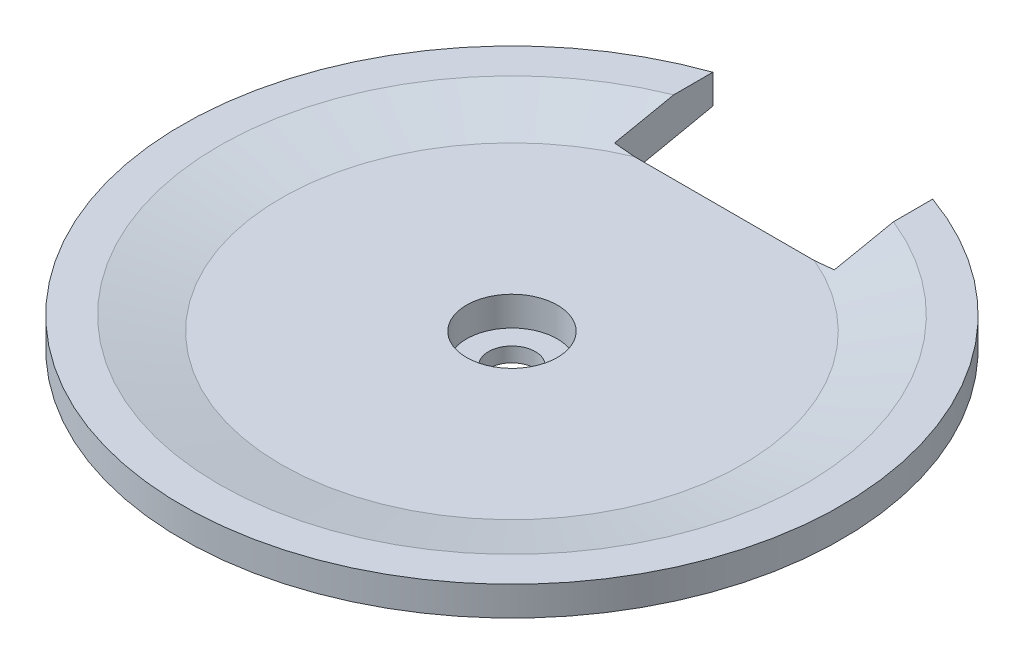
ISO-10303-21;
HEADER;
FILE_DESCRIPTION(('STEP AP214'),'2;1');
FILE_NAME('part.step','',(''),(''),'','','');
FILE_SCHEMA(('AUTOMOTIVE_DESIGN { 1 0 10303 214 1 1 1 1 }'));
ENDSEC;
DATA;
#1=APPLICATION_CONTEXT('core data for automotive mechanical design processes');
#2=APPLICATION_PROTOCOL_DEFINITION('international standard','automotive_design',2000,#1);
#3=PRODUCT_CONTEXT('',#1,'mechanical');
#4=PRODUCT('Part','Part','',(#3));
#5=PRODUCT_RELATED_PRODUCT_CATEGORY('part','',(#4));
#6=PRODUCT_DEFINITION_FORMATION('','',#4);
#7=PRODUCT_DEFINITION_CONTEXT('part definition',#1,'design');
#8=PRODUCT_DEFINITION('design','',#6,#7);
#9=PRODUCT_DEFINITION_SHAPE('','',#8);
#10=(LENGTH_UNIT() NAMED_UNIT(*) SI_UNIT(.MILLI.,.METRE.));
#11=(NAMED_UNIT(*) PLANE_ANGLE_UNIT() SI_UNIT($,.RADIAN.));
#12=(NAMED_UNIT(*) SI_UNIT($,.STERADIAN.) SOLID_ANGLE_UNIT());
#13=UNCERTAINTY_MEASURE_WITH_UNIT(LENGTH_MEASURE(1.E-05),#10,'distance_accuracy_value','');
#14=(GEOMETRIC_REPRESENTATION_CONTEXT(3) GLOBAL_UNCERTAINTY_ASSIGNED_CONTEXT((#13)) GLOBAL_UNIT_ASSIGNED_CONTEXT((#10,
#11,#12)) REPRESENTATION_CONTEXT('',''));
#15=CARTESIAN_POINT('',(0.,0.,0.));
#16=DIRECTION('',(0.,0.,1.));
#17=DIRECTION('',(1.,0.,0.));
#18=AXIS2_PLACEMENT_3D('',#15,#16,#17);
#19=CARTESIAN_POINT('',(0.,-9.52548339959391,0.));
#20=DIRECTION('',(0.,1.,0.));
#21=DIRECTION('',(0.,0.,1.));
#22=AXIS2_PLACEMENT_3D('',#19,#20,#21);
#23=CYLINDRICAL_SURFACE('',#22,1.6);
#24=CARTESIAN_POINT('',(0.,-2.,0.));
#25=DIRECTION('',(0.,1.,0.));
#26=DIRECTION('',(0.,0.,1.));
#27=AXIS2_PLACEMENT_3D('',#24,#25,#26);
#28=CIRCLE('',#27,1.6);
#29=CARTESIAN_POINT('',(0.,-2.,1.6));
#30=VERTEX_POINT('',#29);
#31=EDGE_CURVE('E198',#30,#30,#28,.T.);
#32=ORIENTED_EDGE('',*,*,#31,.T.);
#33=EDGE_LOOP('',(#32));
#34=FACE_BOUND('',#33,.T.);
#35=CARTESIAN_POINT('',(0.,-3.,0.));
#36=DIRECTION('',(0.,-1.,0.));
#37=DIRECTION('',(0.,0.,-1.));
#38=AXIS2_PLACEMENT_3D('',#35,#36,#37);
#39=CIRCLE('',#38,1.6);
#40=CARTESIAN_POINT('',(0.,-3.,-1.6));
#41=VERTEX_POINT('',#40);
#42=EDGE_CURVE('E39',#41,#41,#39,.T.);
#43=ORIENTED_EDGE('',*,*,#42,.T.);
#44=EDGE_LOOP('',(#43));
#45=FACE_BOUND('',#44,.T.);
#46=ADVANCED_FACE('F35',(#34,#45),#23,.F.);
#47=CARTESIAN_POINT('',(-11.2927829378601,-5.,0.));
#48=DIRECTION('',(0.,-1.,0.));
#49=DIRECTION('',(0.,0.,-1.));
#50=AXIS2_PLACEMENT_3D('',#47,#48,#49);
#51=PLANE('',#50);
#52=CARTESIAN_POINT('',(0.,-5.,0.));
#53=DIRECTION('',(0.,1.,0.));
#54=DIRECTION('',(0.,0.,1.));
#55=AXIS2_PLACEMENT_3D('',#52,#53,#54);
#56=CIRCLE('',#55,11.2927829378601);
#57=CARTESIAN_POINT('',(0.,-5.,11.2927829378601));
#58=VERTEX_POINT('',#57);
#59=EDGE_CURVE('E115',#58,#58,#56,.T.);
#60=ORIENTED_EDGE('',*,*,#59,.F.);
#61=EDGE_LOOP('',(#60));
#62=FACE_BOUND('',#61,.T.);
#63=CARTESIAN_POINT('',(4.26480031845422E-09,-5.,11.1141003071461));
#64=CARTESIAN_POINT('',(0.0786658461647855,-5.,11.1141032519882));
#65=CARTESIAN_POINT('',(0.157315676769288,-5.,11.1103797737511));
#66=CARTESIAN_POINT('',(0.313948501857922,-5.,11.0955995036877));
#67=CARTESIAN_POINT('',(0.391931303042091,-5.,11.0845406544976));
#68=CARTESIAN_POINT('',(0.546637267251878,-5.,11.0553740052903));
#69=CARTESIAN_POINT('',(0.623359154844762,-5.,11.0372594768458));
#70=CARTESIAN_POINT('',(0.774957227139395,-5.,10.9944470212953));
#71=CARTESIAN_POINT('',(0.849832544921893,-5.,10.9697460639653));
#72=CARTESIAN_POINT('',(1.0696353393726,-5.,10.8871082554771));
#73=CARTESIAN_POINT('',(1.21129616831553,-5.,10.8203245136018));
#74=CARTESIAN_POINT('',(1.48381466584843,-5.,10.6678218632568));
#75=CARTESIAN_POINT('',(1.61466763685802,-5.,10.58209478004));
#76=CARTESIAN_POINT('',(1.84906864373975,-5.,10.4080710006866));
#77=CARTESIAN_POINT('',(1.95395621602486,-5.,10.3215522782143));
#78=CARTESIAN_POINT('',(2.15576423909522,-5.,10.139607266595));
#79=CARTESIAN_POINT('',(2.25267919938356,-5.,10.0441749339139));
#80=CARTESIAN_POINT('',(2.43916508316452,-5.,9.84602979580943));
#81=CARTESIAN_POINT('',(2.52871902277899,-5.,9.74330111960544));
#82=CARTESIAN_POINT('',(2.70077184398592,-5.,9.53217790921119));
#83=CARTESIAN_POINT('',(2.78327230437074,-5.00000000000001,9.42378465173199));
#84=CARTESIAN_POINT('',(3.00393477304127,-5.00000000000001,9.1156415821704));
#85=CARTESIAN_POINT('',(3.13506957317215,-5.,8.91084636540875));
#86=CARTESIAN_POINT('',(3.37933619416391,-5.,8.4913474837804));
#87=CARTESIAN_POINT('',(3.49249264844667,-5.00000000000001,8.2766579057661));
#88=CARTESIAN_POINT('',(3.67669640049655,-5.00000000000001,7.89488626835507));
#89=CARTESIAN_POINT('',(3.75117006207494,-5.,7.72943773992611));
#90=CARTESIAN_POINT('',(3.89217100010204,-5.,7.39517128466577));
#91=CARTESIAN_POINT('',(3.95869721545439,-5.,7.22635291141642));
#92=CARTESIAN_POINT('',(4.08446055476594,-5.,6.88588963296016));
#93=CARTESIAN_POINT('',(4.14369217258612,-5.,6.71424270215311));
#94=CARTESIAN_POINT('',(4.25532332696383,-5.,6.36873357906713));
#95=CARTESIAN_POINT('',(4.30772206092869,-5.,6.19487112918077));
#96=CARTESIAN_POINT('',(4.45502762084513,-4.99999999999999,5.6716304240704));
#97=CARTESIAN_POINT('',(4.54042488751963,-5.,5.31954634506311));
#98=CARTESIAN_POINT('',(4.68829819875764,-5.00000000000001,4.6107761221247));
#99=CARTESIAN_POINT('',(4.7507799790915,-5.00000000000001,4.25409115297115));
#100=CARTESIAN_POINT('',(4.84145868133455,-5.00000000000001,3.62784252400032));
#101=CARTESIAN_POINT('',(4.87432654343763,-5.,3.35894232614317));
#102=CARTESIAN_POINT('',(4.92863101879915,-5.,2.81996610245077));
#103=CARTESIAN_POINT('',(4.95006663402293,-5.,2.54988997603127));
#104=CARTESIAN_POINT('',(4.9818017501741,-5.,2.00896755494953));
#105=CARTESIAN_POINT('',(4.99209624098875,-5.,1.73812096866095));
#106=CARTESIAN_POINT('',(5.00166919793331,-5.,1.19620245820639));
#107=CARTESIAN_POINT('',(5.00094642200831,-5.,0.925130512078689));
#108=CARTESIAN_POINT('',(4.98870951249801,-5.,0.393562415596116));
#109=CARTESIAN_POINT('',(4.97760747890723,-5.,0.133056725333568));
#110=CARTESIAN_POINT('',(4.9450632858945,-5.,-0.387278216678503));
#111=CARTESIAN_POINT('',(4.92362244845014,-5.,-0.64710755064142));
#112=CARTESIAN_POINT('',(4.87014214830515,-5.,-1.16557045240809));
#113=CARTESIAN_POINT('',(4.83810704012916,-5.,-1.42420446730623));
#114=CARTESIAN_POINT('',(4.76302254821084,-5.,-1.93984333683202));
#115=CARTESIAN_POINT('',(4.71997457600824,-5.00000000000001,-2.19684839592313));
#116=CARTESIAN_POINT('',(4.62238203024166,-5.00000000000001,-2.70807739612169));
#117=CARTESIAN_POINT('',(4.56786360727266,-5.,-2.96230630272461));
#118=CARTESIAN_POINT('',(4.44651371163444,-5.,-3.46766875783845));
#119=CARTESIAN_POINT('',(4.37968953118862,-5.00000000000001,-3.71880404604356));
#120=CARTESIAN_POINT('',(4.23264367867722,-5.00000000000001,-4.21719066019742));
#121=CARTESIAN_POINT('',(4.15241975020649,-5.00000000000001,-4.46444132432339));
#122=CARTESIAN_POINT('',(3.97704487355736,-5.,-4.95412671038003));
#123=CARTESIAN_POINT('',(3.88186865871271,-5.,-5.1965524833188));
#124=CARTESIAN_POINT('',(3.69764778332192,-5.,-5.62164831544952));
#125=CARTESIAN_POINT('',(3.61186276167425,-5.,-5.80572853084391));
#126=CARTESIAN_POINT('',(3.429015543907,-5.,-6.16832879237424));
#127=CARTESIAN_POINT('',(3.33194934696521,-5.,-6.34684683727234));
#128=CARTESIAN_POINT('',(3.12541824290841,-5.,-6.69615470054146));
#129=CARTESIAN_POINT('',(3.01597790226301,-5.,-6.8669589210856));
#130=CARTESIAN_POINT('',(2.78302986812856,-5.,-7.19858267700798));
#131=CARTESIAN_POINT('',(2.65953416566846,-5.,-7.35941054515541));
#132=CARTESIAN_POINT('',(2.39410555878193,-5.,-7.67051549164767));
#133=CARTESIAN_POINT('',(2.25187084051369,-5.,-7.82053876245774));
#134=CARTESIAN_POINT('',(1.94903327259536,-5.,-8.10090575554419));
#135=CARTESIAN_POINT('',(1.78844585018978,-5.,-8.23126579591654));
#136=CARTESIAN_POINT('',(1.47666574880738,-5.,-8.44450267335576));
#137=CARTESIAN_POINT('',(1.32848268885083,-5.,-8.53168177321266));
#138=CARTESIAN_POINT('',(1.09718083059558,-5.,-8.64346020874384));
#139=CARTESIAN_POINT('',(1.01859709924257,-5.,-8.67754830554997));
#140=CARTESIAN_POINT('',(0.858711620875996,-5.,-8.73866117055767));
#141=CARTESIAN_POINT('',(0.777410401075827,-5.00000000000001,-8.76568729996599));
#142=CARTESIAN_POINT('',(0.625869115032893,-5.00000000000001,-8.80823156506452));
#143=CARTESIAN_POINT('',(0.5559510899121,-5.,-8.8249011004528));
#144=CARTESIAN_POINT('',(0.414978759453218,-5.,-8.85240458036671));
#145=CARTESIAN_POINT('',(0.343924638659205,-5.,-8.86323946293688));
#146=CARTESIAN_POINT('',(0.201178253513657,-5.,-8.87882410037442));
#147=CARTESIAN_POINT('',(0.129486256495911,-5.,-8.8835762937463));
#148=CARTESIAN_POINT('',(-0.0140434266797106,-5.,-8.88689034271163));
#149=CARTESIAN_POINT('',(-0.0858811162847217,-5.,-8.88545205008714));
#150=CARTESIAN_POINT('',(-0.229111843726844,-5.,-8.87642281737871));
#151=CARTESIAN_POINT('',(-0.300505177594451,-5.,-8.86883654659148));
#152=CARTESIAN_POINT('',(-0.442422099932242,-5.,-8.84769237561327));
#153=CARTESIAN_POINT('',(-0.512945379213607,-5.,-8.83413241202929));
#154=CARTESIAN_POINT('',(-0.65267769957334,-5.,-8.80133459612795));
#155=CARTESIAN_POINT('',(-0.721886302670932,-5.,-8.78209488574099));
#156=CARTESIAN_POINT('',(-0.858615339756425,-5.,-8.73832618147135));
#157=CARTESIAN_POINT('',(-0.926135366154293,-5.,-8.71379592404474));
#158=CARTESIAN_POINT('',(-1.08159557087878,-5.,-8.65081189338851));
#159=CARTESIAN_POINT('',(-1.16876655579188,-5.,-8.6104499707948));
#160=CARTESIAN_POINT('',(-1.33917379076371,-5.,-8.52215882541521));
#161=CARTESIAN_POINT('',(-1.42240849217491,-5.,-8.47422665593567));
#162=CARTESIAN_POINT('',(-1.66617841134826,-5.,-8.32049674605751));
#163=CARTESIAN_POINT('',(-1.82057147132591,-5.,-8.20485429800505));
#164=CARTESIAN_POINT('',(-2.08231619151322,-5.,-7.9809123517319));
#165=CARTESIAN_POINT('',(-2.19276496169512,-5.,-7.87610721865783));
#166=CARTESIAN_POINT('',(-2.40418375267655,-5.,-7.65723067649529));
#167=CARTESIAN_POINT('',(-2.50514796560614,-5.,-7.54315366848777));
#168=CARTESIAN_POINT('',(-2.69835773486026,-5.,-7.30770055165432));
#169=CARTESIAN_POINT('',(-2.79059360289621,-5.,-7.18631657108724));
#170=CARTESIAN_POINT('',(-2.96703997669666,-5.,-6.93781055375395));
#171=CARTESIAN_POINT('',(-3.05124743251048,-5.,-6.81068636312503));
#172=CARTESIAN_POINT('',(-3.2055512126157,-5.,-6.56272138602552));
#173=CARTESIAN_POINT('',(-3.27623870788876,-5.,-6.44224623858221));
#174=CARTESIAN_POINT('',(-3.41191713881602,-5.,-6.19812018384225));
#175=CARTESIAN_POINT('',(-3.47690707162331,-5.,-6.07446872240462));
#176=CARTESIAN_POINT('',(-3.66402911815055,-5.,-5.69945814797045));
#177=CARTESIAN_POINT('',(-3.77826262259765,-5.,-5.44412635797942));
#178=CARTESIAN_POINT('',(-3.96077449700395,-5.,-4.99404479686881));
#179=CARTESIAN_POINT('',(-4.033250653351,-5.,-4.80095487078525));
#180=CARTESIAN_POINT('',(-4.1690332627517,-5.,-4.41156802699929));
#181=CARTESIAN_POINT('',(-4.2323394914347,-5.,-4.21527103095673));
#182=CARTESIAN_POINT('',(-4.35050790749829,-5.,-3.82000351439792));
#183=CARTESIAN_POINT('',(-4.40536364759327,-5.,-3.62103107726202));
#184=CARTESIAN_POINT('',(-4.50712603312972,-5.,-3.2210555675526));
#185=CARTESIAN_POINT('',(-4.55403179366114,-5.,-3.02005227155985));
#186=CARTESIAN_POINT('',(-4.68327777941367,-5.,-2.41571357018901));
#187=CARTESIAN_POINT('',(-4.7544671017262,-5.,-2.00995470346013));
#188=CARTESIAN_POINT('',(-4.86949820738749,-5.,-1.19481506358371));
#189=CARTESIAN_POINT('',(-4.91334897376248,-5.,-0.785435525021808));
#190=CARTESIAN_POINT('',(-4.9751320620832,-5.,0.035084252292596));
#191=CARTESIAN_POINT('',(-4.99307578662254,-5.,0.446223636510086));
#192=CARTESIAN_POINT('',(-5.00363240562408,-5.,1.26884805678298));
#193=CARTESIAN_POINT('',(-4.99624367695169,-5.,1.68033311329792));
#194=CARTESIAN_POINT('',(-4.95590359101881,-5.,2.5021087814675));
#195=CARTESIAN_POINT('',(-4.92294906812487,-5.,2.91239923888783));
#196=CARTESIAN_POINT('',(-4.83043966368834,-5.,3.73005475365048));
#197=CARTESIAN_POINT('',(-4.77088311430683,-5.,4.13741962594314));
#198=CARTESIAN_POINT('',(-4.63780574139821,-5.,4.86674064305725));
#199=CARTESIAN_POINT('',(-4.56938832916774,-5.,5.18963004232689));
#200=CARTESIAN_POINT('',(-4.41260285157258,-5.,5.83034726354584));
#201=CARTESIAN_POINT('',(-4.32425005586865,-4.99999999999999,6.1481787612069));
#202=CARTESIAN_POINT('',(-4.14972893028624,-5.,6.69958551206613));
#203=CARTESIAN_POINT('',(-4.06835526613213,-5.,6.93467959118497));
#204=CARTESIAN_POINT('',(-3.89144081572472,-5.,7.39998977373256));
#205=CARTESIAN_POINT('',(-3.79587658991606,-5.,7.63019707227019));
#206=CARTESIAN_POINT('',(-3.61132439021038,-5.,8.0344436315617));
#207=CARTESIAN_POINT('',(-3.52537861268023,-5.,8.20986961935995));
#208=CARTESIAN_POINT('',(-3.34268973045649,-5.,8.55513080482755));
#209=CARTESIAN_POINT('',(-3.24594285581495,-5.,8.72496402347942));
#210=CARTESIAN_POINT('',(-3.04060197669031,-5.,9.05693120645611));
#211=CARTESIAN_POINT('',(-2.93203068284634,-5.,9.21907910067013));
#212=CARTESIAN_POINT('',(-2.70149551463402,-5.,9.53345297090586));
#213=CARTESIAN_POINT('',(-2.57954291722028,-5.00000000000001,9.68568713179422));
#214=CARTESIAN_POINT('',(-2.31575371041982,-5.00000000000001,9.98224986079438));
#215=CARTESIAN_POINT('',(-2.17335120074282,-5.,10.1260825283275));
#216=CARTESIAN_POINT('',(-1.87068531413205,-5.,10.3937302241727));
#217=CARTESIAN_POINT('',(-1.71043647964443,-5.00000000000001,10.5175613524057));
#218=CARTESIAN_POINT('',(-1.40021690887219,-5.00000000000001,10.7185103779018));
#219=CARTESIAN_POINT('',(-1.25313588281665,-5.,10.7999914068802));
#220=CARTESIAN_POINT('',(-1.02418856573661,-5.,10.903311525248));
#221=CARTESIAN_POINT('',(-0.946532590653699,-5.,10.9345886611738));
#222=CARTESIAN_POINT('',(-0.788779608736176,-5.,10.9901793244443));
#223=CARTESIAN_POINT('',(-0.708683529875035,-5.,11.0144954633705));
#224=CARTESIAN_POINT('',(-0.525156653132195,-5.,11.0609313925056));
#225=CARTESIAN_POINT('',(-0.42113981898142,-5.,11.0807829985455));
#226=CARTESIAN_POINT('',(-0.2114057978415,-5.,11.1073661159618));
#227=CARTESIAN_POINT('',(-0.105688446412278,-5.00000000000001,11.1140963507173));
#228=CARTESIAN_POINT('',(4.26480031845422E-09,-5.,11.1141003071461));
#229=B_SPLINE_CURVE_WITH_KNOTS('',3,(#63,#64,#65,#66,#67,#68,#69,#70,#71,#72,#73,#74,#75,#76,
#77,#78,#79,#80,#81,#82,#83,#84,#85,#86,#87,#88,#89,#90,#91,#92,#93,#94,#95,#96,#97,#98,#99,
#100,#101,#102,#103,#104,#105,#106,#107,#108,#109,#110,#111,#112,#113,#114,#115,#116,#117,#118,
#119,#120,#121,#122,#123,#124,#125,#126,#127,#128,#129,#130,#131,#132,#133,#134,#135,#136,#137,
#138,#139,#140,#141,#142,#143,#144,#145,#146,#147,#148,#149,#150,#151,#152,#153,#154,#155,#156,
#157,#158,#159,#160,#161,#162,#163,#164,#165,#166,#167,#168,#169,#170,#171,#172,#173,#174,#175,
#176,#177,#178,#179,#180,#181,#182,#183,#184,#185,#186,#187,#188,#189,#190,#191,#192,#193,#194,
#195,#196,#197,#198,#199,#200,#201,#202,#203,#204,#205,#206,#207,#208,#209,#210,#211,#212,#213,
#214,#215,#216,#217,#218,#219,#220,#221,#222,#223,#224,#225,#226,#227,#228),.UNSPECIFIED.,.T.,
.F.,(4,2,2,2,2,2,2,2,2,2,2,2,2,2,2,2,2,2,2,2,2,2,2,2,2,2,2,2,2,2,2,2,2,2,2,2,2,2,2,2,2,2,2,2,2,
2,2,2,2,2,2,2,2,2,2,2,2,2,2,2,2,2,2,2,2,2,2,2,2,2,2,2,2,2,2,2,2,2,2,2,2,2,4),(0.,
0.235882865622866,0.471831917704256,0.708006528263946,0.944289983919165,1.41215435287148,
1.88022101813559,2.28753065840109,2.69511849235696,3.10362178338569,3.51203339772249,
4.24039826945353,4.96775638559954,5.511856528779,6.05602923601613,6.6006102126735,
7.14525509847348,8.23119543752442,9.31686377876006,10.1293296426696,10.9418664232097,
11.754768446192,12.5677621140837,13.3497882128119,14.1317143437909,14.9133194811326,
15.6948244888043,16.4745667441802,17.2538484132388,18.0332614393327,18.8140059875014,
19.4229419222396,20.0320944763906,20.6400582347956,21.2475071559189,21.8663251927756,
22.4846268263795,22.998286927516,23.2549845879309,23.5116327328567,23.7270374193698,
23.9424074646504,24.1576911426238,24.3729799751336,24.5881054520856,24.8033052945739,
25.0185756155964,25.2338974067804,25.5216330491345,25.8094809689322,26.3858467142545,
26.842066531065,27.2985639175236,27.7555622052366,28.2127334180904,28.6316099300301,
29.0505600224096,29.8887525482257,30.5072775270337,31.1258176374138,31.7448273492917,
32.3639059177846,33.5986502261709,34.8329886025651,36.0667835377547,37.3006575277694,
38.5346843241581,39.7687884998719,40.7584207588652,41.7472975592436,42.4932633585501,
43.2404753182488,43.8262029276786,44.4121356187873,44.9969621457656,45.5812995476368,
46.1871042577327,46.7924188783546,47.2947506925682,47.5456258900645,47.7964068421142,
48.113287318239,48.4301986231564),.UNSPECIFIED.);
#230=CARTESIAN_POINT('',(4.26480031845422E-09,-5.,11.1141003071461));
#231=VERTEX_POINT('',#230);
#232=EDGE_CURVE('E233',#231,#231,#229,.T.);
#233=ORIENTED_EDGE('',*,*,#232,.T.);
#234=EDGE_LOOP('',(#233));
#235=FACE_BOUND('',#234,.T.);
#236=ADVANCED_FACE('F244',(#62,#235),#51,.T.);
#237=CARTESIAN_POINT('',(0.,0.,0.));
#238=DIRECTION('',(0.,1.,0.));
#239=DIRECTION('',(0.,0.,1.));
#240=AXIS2_PLACEMENT_3D('',#237,#238,#239);
#241=PLANE('',#240);
#242=CARTESIAN_POINT('',(0.,0.,0.));
#243=DIRECTION('',(0.,1.,0.));
#244=DIRECTION('',(0.,0.,1.));
#245=AXIS2_PLACEMENT_3D('',#242,#243,#244);
#246=CIRCLE('',#245,3.1);
#247=CARTESIAN_POINT('',(0.,0.,3.1));
#248=VERTEX_POINT('',#247);
#249=EDGE_CURVE('E225',#248,#248,#246,.T.);
#250=ORIENTED_EDGE('',*,*,#249,.F.);
#251=EDGE_LOOP('',(#250));
#252=FACE_BOUND('',#251,.T.);
#253=DIRECTION('',(1.,0.,0.));
#254=VECTOR('',#253,1.);
#255=CARTESIAN_POINT('',(0.,0.,-14.5));
#256=LINE('',#255,#254);
#257=CARTESIAN_POINT('',(-6.14918693812443,0.,-14.5));
#258=VERTEX_POINT('',#257);
#259=CARTESIAN_POINT('',(6.14918693812443,0.,-14.5));
#260=VERTEX_POINT('',#259);
#261=EDGE_CURVE('E116',#258,#260,#256,.T.);
#262=ORIENTED_EDGE('',*,*,#261,.F.);
#263=CARTESIAN_POINT('',(0.,0.,0.));
#264=DIRECTION('',(0.,1.,0.));
#265=DIRECTION('',(0.,0.,1.));
#266=AXIS2_PLACEMENT_3D('',#263,#264,#265);
#267=CIRCLE('',#266,15.75);
#268=EDGE_CURVE('E114',#258,#260,#267,.T.);
#269=ORIENTED_EDGE('',*,*,#268,.T.);
#270=EDGE_LOOP('',(#262,#269));
#271=FACE_BOUND('',#270,.T.);
#272=ADVANCED_FACE('F37',(#252,#271),#241,.T.);
#273=CARTESIAN_POINT('',(0.,0.,0.));
#274=DIRECTION('',(0.,1.,0.));
#275=DIRECTION('',(0.,0.,1.));
#276=AXIS2_PLACEMENT_3D('',#273,#274,#275);
#277=CONICAL_SURFACE('',#276,15.75,1.34966311056721);
#278=CARTESIAN_POINT('',(-16.5184388626991,1.40050464463152,-14.5));
#279=CARTESIAN_POINT('',(-16.0553110745307,1.32227174302616,-14.5));
#280=CARTESIAN_POINT('',(-15.5919490201812,1.24540572657069,-14.5));
#281=CARTESIAN_POINT('',(-14.6646879591677,1.0949051455012,-14.5));
#282=CARTESIAN_POINT('',(-14.2007889381178,1.02127066962119,-14.5));
#283=CARTESIAN_POINT('',(-13.2722157430313,0.877705021277555,-14.5));
#284=CARTESIAN_POINT('',(-12.8075413250688,0.807775419081531,-14.5));
#285=CARTESIAN_POINT('',(-11.8775633061992,0.672262815527322,-14.5));
#286=CARTESIAN_POINT('',(-11.412259709316,0.606679786503066,-14.5));
#287=CARTESIAN_POINT('',(-10.0136441547546,0.417221565109857,-14.5));
#288=CARTESIAN_POINT('',(-9.07928799767891,0.300898730937759,-14.5));
#289=CARTESIAN_POINT('',(-7.20766340528211,0.0948918477277755,-14.5));
#290=CARTESIAN_POINT('',(-6.27039531989029,0.00520471413376776,-14.5));
#291=CARTESIAN_POINT('',(-4.86835237384905,-0.103579160699184,-14.5));
#292=CARTESIAN_POINT('',(-4.4045573918837,-0.135427813610193,-14.5));
#293=CARTESIAN_POINT('',(-3.4764423931691,-0.190143425415426,-14.5));
#294=CARTESIAN_POINT('',(-3.01212239007222,-0.213010612706639,-14.5));
#295=CARTESIAN_POINT('',(-2.08311442973462,-0.249150974800655,-14.5));
#296=CARTESIAN_POINT('',(-1.61842647891874,-0.262424313580653,-14.5));
#297=CARTESIAN_POINT('',(-0.688871772814075,-0.27899773698577,-14.5));
#298=CARTESIAN_POINT('',(-0.224005017893555,-0.282297842042594,-14.5));
#299=CARTESIAN_POINT('',(0.705189967841491,-0.278828787050978,-14.5));
#300=CARTESIAN_POINT('',(1.16951823960506,-0.27207046405375,-14.5));
#301=CARTESIAN_POINT('',(2.09792669040018,-0.248702823646628,-14.5));
#302=CARTESIAN_POINT('',(2.56200686824296,-0.232093459450615,-14.5));
#303=CARTESIAN_POINT('',(3.48973834118385,-0.189489075130942,-14.5));
#304=CARTESIAN_POINT('',(3.95338963066752,-0.163493933836993,-14.5));
#305=CARTESIAN_POINT('',(4.8801222565687,-0.102787884395386,-14.5));
#306=CARTESIAN_POINT('',(5.34320358600046,-0.0680768704692415,-14.5));
#307=CARTESIAN_POINT('',(6.25336805994865,0.00798068486207329,-14.5));
#308=CARTESIAN_POINT('',(6.70047291158508,0.0490692705680454,-14.5));
#309=CARTESIAN_POINT('',(7.5939882069649,0.137879826305381,-14.5));
#310=CARTESIAN_POINT('',(8.04039869406103,0.185601363895149,-14.5));
#311=CARTESIAN_POINT('',(9.37893168443263,0.337589390925429,-14.5));
#312=CARTESIAN_POINT('',(10.2700616335119,0.450653705777275,-14.5));
#313=CARTESIAN_POINT('',(11.6077586817992,0.634082582499776,-14.5));
#314=CARTESIAN_POINT('',(12.055271342513,0.697759174145296,-14.5));
#315=CARTESIAN_POINT('',(12.9497192707741,0.829066339573535,-14.5));
#316=CARTESIAN_POINT('',(13.396654538268,0.896696913721692,-14.5));
#317=CARTESIAN_POINT('',(14.28967931314,1.03532875382659,-14.5));
#318=CARTESIAN_POINT('',(14.7357691933086,1.10632763098291,-14.5));
#319=CARTESIAN_POINT('',(15.6274578157833,1.25129726122895,-14.5));
#320=CARTESIAN_POINT('',(16.0730565670301,1.32526795926893,-14.5));
#321=CARTESIAN_POINT('',(16.5184388626991,1.40050464463152,-14.5));
#322=B_SPLINE_CURVE_WITH_KNOTS('',3,(#278,#279,#280,#281,#282,#283,#284,#285,#286,#287,#288,
#289,#290,#291,#292,#293,#294,#295,#296,#297,#298,#299,#300,#301,#302,#303,#304,#305,#306,#307,
#308,#309,#310,#311,#312,#313,#314,#315,#316,#317,#318,#319,#320,#321),.UNSPECIFIED.,.F.,.F.,(4,
2,2,2,2,2,2,2,2,2,2,2,2,2,2,2,2,2,2,2,2,4),(0.,1.40906963911162,2.81817794531046,
4.22787878470928,5.63757065045751,8.46199653196064,11.2860952022332,12.6806835178889,
14.0752363671284,15.4697653802323,16.8642915364266,18.2573163034292,19.6503476864576,
21.0433970541506,22.4364633291325,23.783373892877,25.130196684662,27.8247275519787,
29.1807789026822,30.536830378716,31.8919341146716,33.2470127603624),.UNSPECIFIED.);
#323=CARTESIAN_POINT('',(7.5,0.129226793261795,-14.5));
#324=VERTEX_POINT('',#323);
#325=EDGE_CURVE('E118',#260,#324,#322,.T.);
#326=ORIENTED_EDGE('',*,*,#325,.F.);
#327=ORIENTED_EDGE('',*,*,#268,.F.);
#328=CARTESIAN_POINT('',(-7.5,0.129226793261795,-14.5));
#329=VERTEX_POINT('',#328);
#330=EDGE_CURVE('E59',#329,#258,#322,.T.);
#331=ORIENTED_EDGE('',*,*,#330,.F.);
#332=CARTESIAN_POINT('',(-7.5,2.45251404644585,-25.5825711073085));
#333=CARTESIAN_POINT('',(-7.5,2.30312127378678,-24.8899955994232));
#334=CARTESIAN_POINT('',(-7.5,2.15415719797777,-24.1973270544067));
#335=CARTESIAN_POINT('',(-7.5,1.85739612225133,-22.8117421655533));
#336=CARTESIAN_POINT('',(-7.5,1.70959911899787,-22.1188258224308));
#337=CARTESIAN_POINT('',(-7.5,1.41549315857696,-20.7327368950654));
#338=CARTESIAN_POINT('',(-7.5,1.26918407951681,-20.0395643367128));
#339=CARTESIAN_POINT('',(-7.5,0.978504869035858,-18.6528082095396));
#340=CARTESIAN_POINT('',(-7.5,0.83413474829928,-17.9592246384762));
#341=CARTESIAN_POINT('',(-7.5,0.547982682670647,-16.571455541252));
#342=CARTESIAN_POINT('',(-7.5,0.40620098084824,-15.8772699649057));
#343=CARTESIAN_POINT('',(-7.5,0.126212684683162,-14.4881851278424));
#344=CARTESIAN_POINT('',(-7.5,-0.0119939600627011,-13.7932858773309));
#345=CARTESIAN_POINT('',(-7.5,-0.215491295671527,-12.7501599964825));
#346=CARTESIAN_POINT('',(-7.5,-0.282691283498315,-12.4023059683787));
#347=CARTESIAN_POINT('',(-7.5,-0.415544289994943,-11.7063037511783));
#348=CARTESIAN_POINT('',(-7.5,-0.481197315167678,-11.3581555633247));
#349=CARTESIAN_POINT('',(-7.5,-0.610637390168532,-10.6614944736299));
#350=CARTESIAN_POINT('',(-7.5,-0.674424352341104,-10.31298155545));
#351=CARTESIAN_POINT('',(-7.5,-0.79968581832627,-9.61553565310667));
#352=CARTESIAN_POINT('',(-7.5,-0.861160288385031,-9.26660266288833));
#353=CARTESIAN_POINT('',(-7.5,-0.921255935715827,-8.91742889269146));
#354=B_SPLINE_CURVE_WITH_KNOTS('',3,(#332,#333,#334,#335,#336,#337,#338,#339,#340,#341,#342,
#343,#344,#345,#346,#347,#348,#349,#350,#351,#352,#353),.UNSPECIFIED.,.F.,.F.,(4,2,2,2,2,2,2,2,
2,2,4),(0.,2.12551506294759,4.25102404796643,6.37635748267606,8.5017026237931,10.6272463327759,
12.7527600582806,13.8156139825406,14.8784634381329,15.9413627396004,17.0042775494521),.UNSPECIFIED.);
#355=CARTESIAN_POINT('',(-7.5,0.955440830042887,-18.5404962177392));
#356=VERTEX_POINT('',#355);
#357=EDGE_CURVE('E93',#356,#329,#354,.T.);
#358=ORIENTED_EDGE('',*,*,#357,.F.);
#359=CARTESIAN_POINT('',(0.,0.955440830042887,0.));
#360=DIRECTION('',(0.,1.,0.));
#361=DIRECTION('',(0.,0.,1.));
#362=AXIS2_PLACEMENT_3D('',#359,#360,#361);
#363=CIRCLE('',#362,20.);
#364=CARTESIAN_POINT('',(7.5,0.955440830042887,-18.5404962177392));
#365=VERTEX_POINT('',#364);
#366=EDGE_CURVE('E196',#356,#365,#363,.T.);
#367=ORIENTED_EDGE('',*,*,#366,.T.);
#368=CARTESIAN_POINT('',(7.5,-0.921255935715827,-8.91742889269146));
#369=CARTESIAN_POINT('',(7.5,-0.879564225182803,-9.1597293252584));
#370=CARTESIAN_POINT('',(7.5,-0.837197607352809,-9.40191253016832));
#371=CARTESIAN_POINT('',(7.5,-0.751280342588926,-9.88606733378349));
#372=CARTESIAN_POINT('',(7.5,-0.707729703380957,-10.1280389338589));
#373=CARTESIAN_POINT('',(7.5,-0.575551989038372,-10.8536622128334));
#374=CARTESIAN_POINT('',(7.5,-0.485396836643538,-11.3370355172817));
#375=CARTESIAN_POINT('',(7.5,-0.302003217104026,-12.303161379935));
#376=CARTESIAN_POINT('',(7.5,-0.208764952476023,-12.7859139767561));
#377=CARTESIAN_POINT('',(7.5,-0.0198956539856174,-13.7509539714162));
#378=CARTESIAN_POINT('',(7.5,0.0757353987399356,-14.2332413655567));
#379=CARTESIAN_POINT('',(7.5,0.365389095956329,-15.6794498771043));
#380=CARTESIAN_POINT('',(7.5,0.56219082154291,-16.642813745801));
#381=CARTESIAN_POINT('',(7.5,0.960502436982066,-18.5685793827172));
#382=CARTESIAN_POINT('',(7.5,1.1620124059155,-19.5309811344931));
#383=CARTESIAN_POINT('',(7.5,1.45470827662889,-20.9173840682193));
#384=CARTESIAN_POINT('',(7.5,1.54460561250316,-21.3416577972914));
#385=CARTESIAN_POINT('',(7.5,1.72493507117633,-22.1900889035586));
#386=CARTESIAN_POINT('',(7.5,1.81536719071077,-22.6142462814474));
#387=CARTESIAN_POINT('',(7.5,1.9966916493908,-23.462478984377));
#388=CARTESIAN_POINT('',(7.5,2.08758400540443,-23.8865543058104));
#389=CARTESIAN_POINT('',(7.5,2.26976611988434,-24.734622249021));
#390=CARTESIAN_POINT('',(7.5,2.36105588073089,-25.158614870287));
#391=CARTESIAN_POINT('',(7.5,2.45251404644585,-25.5825711073085));
#392=B_SPLINE_CURVE_WITH_KNOTS('',3,(#368,#369,#370,#371,#372,#373,#374,#375,#376,#377,#378,
#379,#380,#381,#382,#383,#384,#385,#386,#387,#388,#389,#390,#391),.UNSPECIFIED.,.F.,.F.,(4,2,2,
2,2,2,2,2,2,2,2,4),(0.,0.73758079904371,1.47515678641462,2.95026873323053,4.42528397787288,
5.90031085422044,8.85007004995598,11.7998788262678,13.1009579296988,14.402029099175,
15.7031483041869,17.0042753130488),.UNSPECIFIED.);
#393=EDGE_CURVE('E129',#324,#365,#392,.T.);
#394=ORIENTED_EDGE('',*,*,#393,.F.);
#395=EDGE_LOOP('',(#326,#327,#331,#358,#367,#394));
#396=FACE_BOUND('',#395,.T.);
#397=ADVANCED_FACE('F112',(#396),#277,.F.);
#398=CARTESIAN_POINT('',(-20.,0.955440830042887,0.));
#399=DIRECTION('',(0.,1.,0.));
#400=DIRECTION('',(0.,0.,1.));
#401=AXIS2_PLACEMENT_3D('',#398,#399,#400);
#402=PLANE('',#401);
#403=DIRECTION('',(0.,0.,-1.));
#404=VECTOR('',#403,1.);
#405=CARTESIAN_POINT('',(7.5,0.955440830042887,-22.5));
#406=LINE('',#405,#404);
#407=CARTESIAN_POINT('',(7.5,0.955440830042887,-21.2132034355964));
#408=VERTEX_POINT('',#407);
#409=EDGE_CURVE('E197',#365,#408,#406,.T.);
#410=ORIENTED_EDGE('',*,*,#409,.F.);
#411=ORIENTED_EDGE('',*,*,#366,.F.);
#412=DIRECTION('',(0.,0.,1.));
#413=VECTOR('',#412,1.);
#414=CARTESIAN_POINT('',(-7.5,0.955440830042887,-22.5));
#415=LINE('',#414,#413);
#416=CARTESIAN_POINT('',(-7.5,0.955440830042887,-21.2132034355964));
#417=VERTEX_POINT('',#416);
#418=EDGE_CURVE('E96',#417,#356,#415,.T.);
#419=ORIENTED_EDGE('',*,*,#418,.F.);
#420=CARTESIAN_POINT('',(0.,0.955440830042887,0.));
#421=DIRECTION('',(0.,1.,0.));
#422=DIRECTION('',(0.,0.,1.));
#423=AXIS2_PLACEMENT_3D('',#420,#421,#422);
#424=CIRCLE('',#423,22.5);
#425=EDGE_CURVE('E195',#417,#408,#424,.T.);
#426=ORIENTED_EDGE('',*,*,#425,.T.);
#427=EDGE_LOOP('',(#410,#411,#419,#426));
#428=FACE_BOUND('',#427,.T.);
#429=ADVANCED_FACE('F194',(#428),#402,.T.);
#430=CARTESIAN_POINT('',(0.,0.,0.));
#431=DIRECTION('',(0.,1.,0.));
#432=DIRECTION('',(0.,0.,1.));
#433=AXIS2_PLACEMENT_3D('',#430,#431,#432);
#434=CYLINDRICAL_SURFACE('',#433,22.5);
#435=DIRECTION('',(0.,1.,0.));
#436=VECTOR('',#435,1.);
#437=CARTESIAN_POINT('',(7.5,0.,-21.2132034355964));
#438=LINE('',#437,#436);
#439=CARTESIAN_POINT('',(7.5,-1.04493071043749,-21.2132034355964));
#440=VERTEX_POINT('',#439);
#441=EDGE_CURVE('E131',#408,#440,#438,.F.);
#442=ORIENTED_EDGE('',*,*,#441,.F.);
#443=ORIENTED_EDGE('',*,*,#425,.F.);
#444=DIRECTION('',(0.,1.,0.));
#445=VECTOR('',#444,1.);
#446=CARTESIAN_POINT('',(-7.5,0.,-21.2132034355964));
#447=LINE('',#446,#445);
#448=CARTESIAN_POINT('',(-7.5,-1.04493071043749,-21.2132034355964));
#449=VERTEX_POINT('',#448);
#450=EDGE_CURVE('E101',#449,#417,#447,.T.);
#451=ORIENTED_EDGE('',*,*,#450,.F.);
#452=CARTESIAN_POINT('',(0.,-1.04493071043749,0.));
#453=DIRECTION('',(0.,1.,0.));
#454=DIRECTION('',(0.,0.,1.));
#455=AXIS2_PLACEMENT_3D('',#452,#453,#454);
#456=CIRCLE('',#455,22.5);
#457=EDGE_CURVE('E201',#449,#440,#456,.T.);
#458=ORIENTED_EDGE('',*,*,#457,.T.);
#459=EDGE_LOOP('',(#442,#443,#451,#458));
#460=FACE_BOUND('',#459,.T.);
#461=ADVANCED_FACE('F176',(#460),#434,.T.);
#462=CARTESIAN_POINT('',(0.,-1.04493071043749,0.));
#463=DIRECTION('',(0.,1.,0.));
#464=DIRECTION('',(0.,0.,1.));
#465=AXIS2_PLACEMENT_3D('',#462,#463,#464);
#466=CONICAL_SURFACE('',#465,22.5,1.34966311056721);
#467=CARTESIAN_POINT('',(7.5,0.975966723279772,-30.5831754080216));
#468=CARTESIAN_POINT('',(7.5,0.756887997005337,-29.5796250760711));
#469=CARTESIAN_POINT('',(7.5,0.538327358003182,-28.5759606623793));
#470=CARTESIAN_POINT('',(7.5,0.102791609453874,-26.5683091052525));
#471=CARTESIAN_POINT('',(7.5,-0.114183531807266,-25.5643219686946));
#472=CARTESIAN_POINT('',(7.5,-0.545971315128151,-23.5560596673638));
#473=CARTESIAN_POINT('',(7.5,-0.760784316044881,-22.5517845798199));
#474=CARTESIAN_POINT('',(7.5,-1.1873826958592,-20.5425656907216));
#475=CARTESIAN_POINT('',(7.5,-1.39916800536385,-19.5376218743909));
#476=CARTESIAN_POINT('',(7.5,-1.71346697188433,-18.0293666188324));
#477=CARTESIAN_POINT('',(7.5,-1.81768332938321,-17.5264101285716));
#478=CARTESIAN_POINT('',(7.5,-2.02469000094744,-16.5202045042529));
#479=CARTESIAN_POINT('',(7.5,-2.12748031797491,-16.0169553708051));
#480=CARTESIAN_POINT('',(7.5,-2.33126151766269,-15.0101213099111));
#481=CARTESIAN_POINT('',(7.5,-2.43225249920916,-14.5065364025058));
#482=CARTESIAN_POINT('',(7.5,-2.63193935922608,-13.4989063531685));
#483=CARTESIAN_POINT('',(7.5,-2.73063521854903,-12.9948612074334));
#484=CARTESIAN_POINT('',(7.5,-2.92506214763086,-11.9860799702798));
#485=CARTESIAN_POINT('',(7.5,-3.02079254160518,-11.4813437483444));
#486=CARTESIAN_POINT('',(7.5,-3.20830532766151,-10.4711462738942));
#487=CARTESIAN_POINT('',(7.5,-3.30008781369185,-9.96568503892858));
#488=CARTESIAN_POINT('',(7.5,-3.43377967277724,-9.20674204797709));
#489=CARTESIAN_POINT('',(7.5,-3.47768398627642,-8.95361163441675));
#490=CARTESIAN_POINT('',(7.5,-3.56393357924541,-8.44708636428837));
#491=CARTESIAN_POINT('',(7.5,-3.60627886794347,-8.19369150929479));
#492=CARTESIAN_POINT('',(7.5,-3.68915646676772,-7.68658370322908));
#493=CARTESIAN_POINT('',(7.5,-3.72968863217339,-7.43287072842083));
#494=CARTESIAN_POINT('',(7.5,-3.80861594325347,-6.92510766656558));
#495=CARTESIAN_POINT('',(7.5,-3.84701104461438,-6.67105757263993));
#496=CARTESIAN_POINT('',(7.5,-3.88417653873717,-6.41682459197843));
#497=B_SPLINE_CURVE_WITH_KNOTS('',3,(#467,#468,#469,#470,#471,#472,#473,#474,#475,#476,#477,
#478,#479,#480,#481,#482,#483,#484,#485,#486,#487,#488,#489,#490,#491,#492,#493,#494,#495,#496),
.UNSPECIFIED.,.F.,.F.,(4,2,2,2,2,2,2,2,2,2,2,2,2,2,4),(0.,3.08155596685476,6.1630501250973,
9.24402411313377,12.325068602473,13.8659877268453,15.4069036499994,16.947734626117,
18.4885784523073,20.0297708681865,21.5709265880153,22.3416517738389,23.1123723968077,
23.883154428055,24.6539524360508),.UNSPECIFIED.);
#498=CARTESIAN_POINT('',(7.5,-2.20013261775991,-15.6578715669129));
#499=VERTEX_POINT('',#498);
#500=EDGE_CURVE('E100',#440,#499,#497,.T.);
#501=ORIENTED_EDGE('',*,*,#500,.F.);
#502=ORIENTED_EDGE('',*,*,#457,.F.);
#503=CARTESIAN_POINT('',(-7.5,-3.88417653873717,-6.41682459197843));
#504=CARTESIAN_POINT('',(-7.5,-3.85403761370699,-6.62302198954797));
#505=CARTESIAN_POINT('',(-7.5,-3.8230844563899,-6.82909861663561));
#506=CARTESIAN_POINT('',(-7.5,-3.75973077689577,-7.24102681364921));
#507=CARTESIAN_POINT('',(-7.5,-3.7273302730573,-7.44687838639287));
#508=CARTESIAN_POINT('',(-7.5,-3.62823198377351,-8.06410454165991));
#509=CARTESIAN_POINT('',(-7.5,-3.55963393145781,-8.47517414485542));
#510=CARTESIAN_POINT('',(-7.5,-3.41851985054566,-9.29656918534114));
#511=CARTESIAN_POINT('',(-7.5,-3.34600443835486,-9.70689472926932));
#512=CARTESIAN_POINT('',(-7.5,-3.19789659541876,-10.5269956329248));
#513=CARTESIAN_POINT('',(-7.5,-3.12230411384733,-10.9367709834486));
#514=CARTESIAN_POINT('',(-7.5,-2.96870679268746,-11.7557758996472));
#515=CARTESIAN_POINT('',(-7.5,-2.89070248102884,-12.1650055645951));
#516=CARTESIAN_POINT('',(-7.5,-2.73275016923678,-12.9830900356446));
#517=CARTESIAN_POINT('',(-7.5,-2.65280216370883,-13.3919448407026));
#518=CARTESIAN_POINT('',(-7.5,-2.41061887827086,-14.6180850445486));
#519=CARTESIAN_POINT('',(-7.5,-2.24605127953976,-15.434909580275));
#520=CARTESIAN_POINT('',(-7.5,-1.95729435912224,-16.8494862240853));
#521=CARTESIAN_POINT('',(-7.5,-1.83406981417402,-17.4474364493445));
#522=CARTESIAN_POINT('',(-7.5,-1.58588358314943,-18.6429765187378));
#523=CARTESIAN_POINT('',(-7.5,-1.4609218965554,-19.2405663627645));
#524=CARTESIAN_POINT('',(-7.5,-1.08403547789849,-21.0328906332212));
#525=CARTESIAN_POINT('',(-7.5,-0.830104651529337,-22.2272028294897));
#526=CARTESIAN_POINT('',(-7.5,-0.318779287304131,-24.6154011090549));
#527=CARTESIAN_POINT('',(-7.5,-0.0613838849334579,-25.8092870067213));
#528=CARTESIAN_POINT('',(-7.5,0.326449570401108,-27.5997437849114));
#529=CARTESIAN_POINT('',(-7.5,0.456018001989602,-28.1965032357116));
#530=CARTESIAN_POINT('',(-7.5,0.715646065506288,-29.389914929144));
#531=CARTESIAN_POINT('',(-7.5,0.845705697151732,-29.9865671718376));
#532=CARTESIAN_POINT('',(-7.5,0.975966723279772,-30.5831754080216));
#533=B_SPLINE_CURVE_WITH_KNOTS('',3,(#503,#504,#505,#506,#507,#508,#509,#510,#511,#512,#513,
#514,#515,#516,#517,#518,#519,#520,#521,#522,#523,#524,#525,#526,#527,#528,#529,#530,#531,#532),
.UNSPECIFIED.,.F.,.F.,(4,2,2,2,2,2,2,2,2,2,2,2,2,2,4),(0.,0.625160859308897,1.25031379977449,
2.50054816526364,3.75058637327724,5.00064523743669,6.25043238456517,7.50022300073215,
9.99991614424135,11.8314595806267,13.6630035628285,17.326020988298,20.9899700444455,
22.8219601487073,24.6539491985819),.UNSPECIFIED.);
#534=CARTESIAN_POINT('',(-7.5,-2.20013261775992,-15.6578715669129));
#535=VERTEX_POINT('',#534);
#536=EDGE_CURVE('E107',#535,#449,#533,.T.);
#537=ORIENTED_EDGE('',*,*,#536,.F.);
#538=CARTESIAN_POINT('',(0.,-2.20013261775991,0.));
#539=DIRECTION('',(0.,1.,0.));
#540=DIRECTION('',(0.,0.,1.));
#541=AXIS2_PLACEMENT_3D('',#538,#539,#540);
#542=CIRCLE('',#541,17.3614210825594);
#543=EDGE_CURVE('E120',#535,#499,#542,.T.);
#544=ORIENTED_EDGE('',*,*,#543,.T.);
#545=EDGE_LOOP('',(#501,#502,#537,#544));
#546=FACE_BOUND('',#545,.T.);
#547=ADVANCED_FACE('F171',(#546),#466,.T.);
#548=CARTESIAN_POINT('',(0.,-2.20013261775991,0.));
#549=DIRECTION('',(0.,1.,0.));
#550=DIRECTION('',(0.,0.,1.));
#551=AXIS2_PLACEMENT_3D('',#548,#549,#550);
#552=CONICAL_SURFACE('',#551,17.3614210825594,1.13853018239285);
#553=CARTESIAN_POINT('',(7.5,0.236688110051122,-21.3649931574292));
#554=CARTESIAN_POINT('',(7.5,0.0410741891908778,-20.9156115504722));
#555=CARTESIAN_POINT('',(7.5,-0.153990729657992,-20.4659899757748));
#556=CARTESIAN_POINT('',(7.5,-0.542756054282054,-19.5661565942223));
#557=CARTESIAN_POINT('',(7.5,-0.736456457846591,-19.1159447864123));
#558=CARTESIAN_POINT('',(7.5,-1.1221982709913,-18.2148859525305));
#559=CARTESIAN_POINT('',(7.5,-1.31423991180075,-17.7640390255275));
#560=CARTESIAN_POINT('',(7.5,-1.69632941483835,-16.8615013336572));
#561=CARTESIAN_POINT('',(7.5,-1.88637728032055,-16.4098105701685));
#562=CARTESIAN_POINT('',(7.5,-2.26403526077054,-15.5053471071335));
#563=CARTESIAN_POINT('',(7.5,-2.45164508474915,-15.0525742859377));
#564=CARTESIAN_POINT('',(7.5,-2.82378125714446,-14.1457687820947));
#565=CARTESIAN_POINT('',(7.5,-3.00830764606856,-13.6917361160897));
#566=CARTESIAN_POINT('',(7.5,-3.37347600400668,-12.7820313524773));
#567=CARTESIAN_POINT('',(7.5,-3.5541174143847,-12.3263590299493));
#568=CARTESIAN_POINT('',(7.5,-3.82128611872288,-11.6413591659089));
#569=CARTESIAN_POINT('',(7.5,-3.90971209361353,-11.4127720792314));
#570=CARTESIAN_POINT('',(7.5,-4.08510589500558,-10.9550366440175));
#571=CARTESIAN_POINT('',(7.5,-4.1720737061401,-10.7258882895953));
#572=CARTESIAN_POINT('',(7.5,-4.2582153975659,-10.4964279251302));
#573=B_SPLINE_CURVE_WITH_KNOTS('',3,(#553,#554,#555,#556,#557,#558,#559,#560,#561,#562,#563,
#564,#565,#566,#567,#568,#569,#570,#571,#572),.UNSPECIFIED.,.F.,.F.,(4,2,2,2,2,2,2,2,2,4),(0.,
1.4703335050811,2.94066939170736,4.41079689588961,5.88092200030521,7.35122098712066,
8.82150064325027,10.2919903217875,11.0272687322011,11.762554886492),.UNSPECIFIED.);
#574=CARTESIAN_POINT('',(7.5,-2.67838224853265,-14.5));
#575=VERTEX_POINT('',#574);
#576=EDGE_CURVE('E11',#499,#575,#573,.T.);
#577=ORIENTED_EDGE('',*,*,#576,.F.);
#578=ORIENTED_EDGE('',*,*,#543,.F.);
#579=CARTESIAN_POINT('',(-7.5,-4.2582153975659,-10.4964279251302));
#580=CARTESIAN_POINT('',(-7.5,-4.1720737061401,-10.7258882895953));
#581=CARTESIAN_POINT('',(-7.5,-4.08510589500558,-10.9550366440175));
#582=CARTESIAN_POINT('',(-7.5,-3.90971209361353,-11.4127720792314));
#583=CARTESIAN_POINT('',(-7.5,-3.82128611872288,-11.6413591659089));
#584=CARTESIAN_POINT('',(-7.5,-3.5541174143847,-12.3263590299493));
#585=CARTESIAN_POINT('',(-7.5,-3.37347600400669,-12.7820313524773));
#586=CARTESIAN_POINT('',(-7.5,-3.00830764606857,-13.6917361160897));
#587=CARTESIAN_POINT('',(-7.5,-2.82378125714446,-14.1457687820947));
#588=CARTESIAN_POINT('',(-7.5,-2.45164508474916,-15.0525742859377));
#589=CARTESIAN_POINT('',(-7.5,-2.26403526077054,-15.5053471071335));
#590=CARTESIAN_POINT('',(-7.5,-1.88637728032055,-16.4098105701685));
#591=CARTESIAN_POINT('',(-7.5,-1.69632941483835,-16.8615013336572));
#592=CARTESIAN_POINT('',(-7.5,-1.31423991180075,-17.7640390255275));
#593=CARTESIAN_POINT('',(-7.5,-1.12219827099131,-18.2148859525305));
#594=CARTESIAN_POINT('',(-7.5,-0.736456457846594,-19.1159447864123));
#595=CARTESIAN_POINT('',(-7.5,-0.542756054282058,-19.5661565942223));
#596=CARTESIAN_POINT('',(-7.5,-0.153990729657994,-20.4659899757748));
#597=CARTESIAN_POINT('',(-7.5,0.0410741891908757,-20.9156115504722));
#598=CARTESIAN_POINT('',(-7.5,0.23668811005112,-21.3649931574292));
#599=B_SPLINE_CURVE_WITH_KNOTS('',3,(#579,#580,#581,#582,#583,#584,#585,#586,#587,#588,#589,
#590,#591,#592,#593,#594,#595,#596,#597,#598),.UNSPECIFIED.,.F.,.F.,(4,2,2,2,2,2,2,2,2,4),(0.,
0.735286154290816,1.47056456470442,2.94105424324167,4.41133389937129,5.88163288618674,
7.35175799060235,8.82188549478458,10.2922213814108,11.762554886492),.UNSPECIFIED.);
#600=CARTESIAN_POINT('',(-7.5,-2.67838224853265,-14.5));
#601=VERTEX_POINT('',#600);
#602=EDGE_CURVE('E208',#601,#535,#599,.T.);
#603=ORIENTED_EDGE('',*,*,#602,.F.);
#604=CARTESIAN_POINT('',(22.7592713137508,2.24024384704919,-14.5));
#605=CARTESIAN_POINT('',(22.3992092840382,2.10014491197095,-14.5));
#606=CARTESIAN_POINT('',(22.038825709717,1.96087273249645,-14.5));
#607=CARTESIAN_POINT('',(21.317340343869,1.68419032481675,-14.5));
#608=CARTESIAN_POINT('',(20.9562385447773,1.54678011634403,-14.5));
#609=CARTESIAN_POINT('',(19.8716441407558,1.13761788499544,-14.5));
#610=CARTESIAN_POINT('',(19.1469724719217,0.86897717989072,-14.5));
#611=CARTESIAN_POINT('',(17.6898604238508,0.340736988407975,-14.5));
#612=CARTESIAN_POINT('',(16.9573992295564,0.0811947424746516,-14.5));
#613=CARTESIAN_POINT('',(15.4878199228178,-0.424325014348838,-14.5));
#614=CARTESIAN_POINT('',(14.7507019988197,-0.670303070278388,-14.5));
#615=CARTESIAN_POINT('',(13.2816226955113,-1.14127754484821,-14.5));
#616=CARTESIAN_POINT('',(12.5497432653788,-1.36652795597847,-14.5));
#617=CARTESIAN_POINT('',(11.079456032113,-1.79501460869665,-14.5));
#618=CARTESIAN_POINT('',(10.3410478181876,-1.99824945424527,-14.5));
#619=CARTESIAN_POINT('',(8.85820841567293,-2.37589021576505,-14.5));
#620=CARTESIAN_POINT('',(8.11379026297014,-2.55034672342794,-14.5));
#621=CARTESIAN_POINT('',(6.61734307936433,-2.86300292971621,-14.5));
#622=CARTESIAN_POINT('',(5.86531534920599,-3.00120871965757,-14.5));
#623=CARTESIAN_POINT('',(4.52966890506595,-3.2060173162592,-14.5));
#624=CARTESIAN_POINT('',(3.94746521280465,-3.28179358947407,-14.5));
#625=CARTESIAN_POINT('',(2.77992272889196,-3.40351038083117,-14.5));
#626=CARTESIAN_POINT('',(2.19458411809375,-3.44945260179622,-14.5));
#627=CARTESIAN_POINT('',(1.02256950201157,-3.50906233660513,-14.5));
#628=CARTESIAN_POINT('',(0.435894435743182,-3.52274801507282,-14.5));
#629=CARTESIAN_POINT('',(-0.73729991074038,-3.51712324452863,-14.5));
#630=CARTESIAN_POINT('',(-1.32381918964798,-3.49781252680639,-14.5));
#631=CARTESIAN_POINT('',(-2.49563664966583,-3.42723666807927,-14.5));
#632=CARTESIAN_POINT('',(-3.08093237649905,-3.37593147818628,-14.5));
#633=CARTESIAN_POINT('',(-4.24817902999448,-3.24398753750259,-14.5));
#634=CARTESIAN_POINT('',(-4.83012982362814,-3.16334762815307,-14.5));
#635=CARTESIAN_POINT('',(-5.99042718527155,-2.97622513073803,-14.5));
#636=CARTESIAN_POINT('',(-6.56876937821126,-2.86971576823978,-14.5));
#637=CARTESIAN_POINT('',(-7.7209372764002,-2.63476386956885,-14.5));
#638=CARTESIAN_POINT('',(-8.29476294310773,-2.50632114644008,-14.5));
#639=CARTESIAN_POINT('',(-9.46093097197647,-2.22564642232759,-14.5));
#640=CARTESIAN_POINT('',(-10.0530918508061,-2.07266637900701,-14.5));
#641=CARTESIAN_POINT('',(-11.2329759764251,-1.75056148347738,-14.5));
#642=CARTESIAN_POINT('',(-11.8206992045664,-1.58143656346429,-14.5));
#643=CARTESIAN_POINT('',(-12.9920120076562,-1.23010671526936,-14.5));
#644=CARTESIAN_POINT('',(-13.5756027572065,-1.04790568241229,-14.5));
#645=CARTESIAN_POINT('',(-14.7393217118945,-0.67282285209005,-14.5));
#646=CARTESIAN_POINT('',(-15.3194499472783,-0.479941148075648,-14.5));
#647=CARTESIAN_POINT('',(-16.4749662119929,-0.0860486669745167,-14.5));
#648=CARTESIAN_POINT('',(-17.0503632829905,0.114935670597438,-14.5));
#649=CARTESIAN_POINT('',(-18.1986159245734,0.524042571919658,-14.5));
#650=CARTESIAN_POINT('',(-18.771471464771,0.732165220760567,-14.5));
#651=CARTESIAN_POINT('',(-19.9145703963578,1.15414845490261,-14.5));
#652=CARTESIAN_POINT('',(-20.4848154284453,1.36800460649446,-14.5));
#653=CARTESIAN_POINT('',(-21.6233938754527,1.80065364894145,-14.5));
#654=CARTESIAN_POINT('',(-22.1917273977411,2.01944625701142,-14.5));
#655=CARTESIAN_POINT('',(-22.7592713137508,2.24024384704918,-14.5));
#656=B_SPLINE_CURVE_WITH_KNOTS('',3,(#604,#605,#606,#607,#608,#609,#610,#611,#612,#613,#614,
#615,#616,#617,#618,#619,#620,#621,#622,#623,#624,#625,#626,#627,#628,#629,#630,#631,#632,#633,
#634,#635,#636,#637,#638,#639,#640,#641,#642,#643,#644,#645,#646,#647,#648,#649,#650,#651,#652,
#653,#654,#655),.UNSPECIFIED.,.F.,.F.,(4,2,2,2,2,2,2,2,2,2,2,2,2,2,2,2,2,2,2,2,2,2,2,2,2,4),(0.,
1.1590715899904,2.31815545379773,4.63667723753139,6.96783235032237,9.29889372374723,
11.5959058435789,13.8930635351581,16.1861388142747,18.4788285339295,20.2395028481646,
22.0000766604645,23.7596588038717,25.5192552767288,27.2810587472452,29.0429318067894,
30.8066362033043,32.5703556340735,34.4048825614697,36.2394171937148,38.0734075754724,
39.9073819132266,41.7357918937779,43.5642236770613,45.3912801512241,47.2182322267784),.UNSPECIFIED.);
#657=EDGE_CURVE('E44',#575,#601,#656,.T.);
#658=ORIENTED_EDGE('',*,*,#657,.F.);
#659=EDGE_LOOP('',(#577,#578,#603,#658));
#660=FACE_BOUND('',#659,.T.);
#661=ORIENTED_EDGE('',*,*,#59,.T.);
#662=EDGE_LOOP('',(#661));
#663=FACE_BOUND('',#662,.T.);
#664=ADVANCED_FACE('F175',(#660,#663),#552,.T.);
#665=CARTESIAN_POINT('',(-7.5,-22.,-14.5));
#666=DIRECTION('',(0.,0.,1.));
#667=DIRECTION('',(1.,0.,0.));
#668=AXIS2_PLACEMENT_3D('',#665,#666,#667);
#669=PLANE('',#668);
#670=ORIENTED_EDGE('',*,*,#330,.T.);
#671=ORIENTED_EDGE('',*,*,#261,.T.);
#672=ORIENTED_EDGE('',*,*,#325,.T.);
#673=DIRECTION('',(0.,1.,0.));
#674=VECTOR('',#673,1.);
#675=CARTESIAN_POINT('',(7.5,-22.,-14.5));
#676=LINE('',#675,#674);
#677=EDGE_CURVE('E108',#575,#324,#676,.T.);
#678=ORIENTED_EDGE('',*,*,#677,.F.);
#679=ORIENTED_EDGE('',*,*,#657,.T.);
#680=DIRECTION('',(0.,1.,0.));
#681=VECTOR('',#680,1.);
#682=CARTESIAN_POINT('',(-7.5,-22.,-14.5));
#683=LINE('',#682,#681);
#684=EDGE_CURVE('E52',#601,#329,#683,.T.);
#685=ORIENTED_EDGE('',*,*,#684,.T.);
#686=EDGE_LOOP('',(#670,#671,#672,#678,#679,#685));
#687=FACE_BOUND('',#686,.T.);
#688=ADVANCED_FACE('F103',(#687),#669,.F.);
#689=CARTESIAN_POINT('',(7.5,-22.,-22.5));
#690=DIRECTION('',(1.,0.,0.));
#691=DIRECTION('',(0.,0.,-1.));
#692=AXIS2_PLACEMENT_3D('',#689,#690,#691);
#693=PLANE('',#692);
#694=ORIENTED_EDGE('',*,*,#393,.T.);
#695=ORIENTED_EDGE('',*,*,#409,.T.);
#696=ORIENTED_EDGE('',*,*,#441,.T.);
#697=ORIENTED_EDGE('',*,*,#500,.T.);
#698=ORIENTED_EDGE('',*,*,#576,.T.);
#699=ORIENTED_EDGE('',*,*,#677,.T.);
#700=EDGE_LOOP('',(#694,#695,#696,#697,#698,#699));
#701=FACE_BOUND('',#700,.T.);
#702=ADVANCED_FACE('F144',(#701),#693,.F.);
#703=CARTESIAN_POINT('',(-7.5,-22.,-22.5));
#704=DIRECTION('',(-1.,0.,0.));
#705=DIRECTION('',(0.,0.,1.));
#706=AXIS2_PLACEMENT_3D('',#703,#704,#705);
#707=PLANE('',#706);
#708=ORIENTED_EDGE('',*,*,#357,.T.);
#709=ORIENTED_EDGE('',*,*,#684,.F.);
#710=ORIENTED_EDGE('',*,*,#602,.T.);
#711=ORIENTED_EDGE('',*,*,#536,.T.);
#712=ORIENTED_EDGE('',*,*,#450,.T.);
#713=ORIENTED_EDGE('',*,*,#418,.T.);
#714=EDGE_LOOP('',(#708,#709,#710,#711,#712,#713));
#715=FACE_BOUND('',#714,.T.);
#716=ADVANCED_FACE('F94',(#715),#707,.F.);
#717=CARTESIAN_POINT('',(0.,-2.,0.));
#718=DIRECTION('',(0.,1.,0.));
#719=DIRECTION('',(0.,0.,1.));
#720=AXIS2_PLACEMENT_3D('',#717,#718,#719);
#721=CYLINDRICAL_SURFACE('',#720,3.1);
#722=CARTESIAN_POINT('',(0.,-2.,0.));
#723=DIRECTION('',(0.,1.,0.));
#724=DIRECTION('',(0.,0.,1.));
#725=AXIS2_PLACEMENT_3D('',#722,#723,#724);
#726=CIRCLE('',#725,3.1);
#727=CARTESIAN_POINT('',(0.,-2.,3.1));
#728=VERTEX_POINT('',#727);
#729=EDGE_CURVE('E228',#728,#728,#726,.T.);
#730=ORIENTED_EDGE('',*,*,#729,.F.);
#731=EDGE_LOOP('',(#730));
#732=FACE_BOUND('',#731,.T.);
#733=ORIENTED_EDGE('',*,*,#249,.T.);
#734=EDGE_LOOP('',(#733));
#735=FACE_BOUND('',#734,.T.);
#736=ADVANCED_FACE('F265',(#732,#735),#721,.F.);
#737=CARTESIAN_POINT('',(0.,-2.,0.));
#738=DIRECTION('',(0.,1.,0.));
#739=DIRECTION('',(0.,0.,1.));
#740=AXIS2_PLACEMENT_3D('',#737,#738,#739);
#741=PLANE('',#740);
#742=ORIENTED_EDGE('',*,*,#31,.F.);
#743=EDGE_LOOP('',(#742));
#744=FACE_BOUND('',#743,.T.);
#745=ORIENTED_EDGE('',*,*,#729,.T.);
#746=EDGE_LOOP('',(#745));
#747=FACE_BOUND('',#746,.T.);
#748=ADVANCED_FACE('F254',(#744,#747),#741,.T.);
#749=CARTESIAN_POINT('',(0.,-3.,0.));
#750=DIRECTION('',(0.,-1.,0.));
#751=DIRECTION('',(0.,0.,-1.));
#752=AXIS2_PLACEMENT_3D('',#749,#750,#751);
#753=PLANE('',#752);
#754=ORIENTED_EDGE('',*,*,#42,.F.);
#755=EDGE_LOOP('',(#754));
#756=FACE_BOUND('',#755,.T.);
#757=CARTESIAN_POINT('',(0.,-3.,0.));
#758=DIRECTION('',(0.,-1.,0.));
#759=DIRECTION('',(4.26480031845422E-10,0.,1.));
#760=AXIS2_PLACEMENT_3D('',#757,#758,#759);
#761=ELLIPSE('',#760,10.,5.);
#762=CARTESIAN_POINT('',(4.26480031845422E-09,-3.,9.99999999999999));
#763=VERTEX_POINT('',#762);
#764=EDGE_CURVE('E231',#763,#763,#761,.T.);
#765=ORIENTED_EDGE('',*,*,#764,.T.);
#766=EDGE_LOOP('',(#765));
#767=FACE_BOUND('',#766,.T.);
#768=ADVANCED_FACE('F252',(#756,#767),#753,.T.);
#769=CARTESIAN_POINT('',(4.26480031845422E-09,-50.,36.1813572179332));
#770=CARTESIAN_POINT('',(4.26480031845422E-09,-3.,10.));
#771=CARTESIAN_POINT('',(-9.99999999573519,-50.,36.181357222198));
#772=CARTESIAN_POINT('',(-9.99999999573519,-3.,10.0000000042648));
#773=CARTESIAN_POINT('',(-10.0000000042648,-50.,16.181357222198));
#774=CARTESIAN_POINT('',(-10.0000000042648,-3.,-9.99999999573521));
#775=CARTESIAN_POINT('',(-4.26480093077762E-09,-50.,16.1813572179332));
#776=CARTESIAN_POINT('',(-4.26480093077762E-09,-3.,-10.));
#777=CARTESIAN_POINT('',(9.99999999573519,-50.,16.1813572136684));
#778=CARTESIAN_POINT('',(9.99999999573519,-3.,-10.0000000042648));
#779=CARTESIAN_POINT('',(10.0000000042648,-50.,36.1813572136684));
#780=CARTESIAN_POINT('',(10.0000000042648,-3.,9.9999999957352));
#781=CARTESIAN_POINT('',(4.26480031845422E-09,-50.,36.1813572179332));
#782=CARTESIAN_POINT('',(4.26480031845422E-09,-3.,10.));
#783=(BOUNDED_SURFACE() B_SPLINE_SURFACE(3,1,((#769,#770),(#771,#772),(#773,#774),(#775,#776),
(#777,#778),(#779,#780),(#781,#782)),.UNSPECIFIED.,.T.,.F.,.F.) B_SPLINE_SURFACE_WITH_KNOTS((4,
3,4),(2,2),(0.,0.5,1.),(0.,1.),
.UNSPECIFIED.) GEOMETRIC_REPRESENTATION_ITEM() RATIONAL_B_SPLINE_SURFACE(((1.,1.),
(0.333333333333333,0.333333333333333),(0.333333333333333,0.333333333333333),(1.,1.),
(0.333333333333333,0.333333333333333),(0.333333333333333,0.333333333333333),(1.,1.))) REPRESENTATION_ITEM('') SURFACE());
#784=ORIENTED_EDGE('',*,*,#232,.F.);
#785=EDGE_LOOP('',(#784));
#786=FACE_BOUND('',#785,.T.);
#787=ORIENTED_EDGE('',*,*,#764,.F.);
#788=EDGE_LOOP('',(#787));
#789=FACE_BOUND('',#788,.T.);
#790=ADVANCED_FACE('F246',(#786,#789),#783,.T.);
#791=CLOSED_SHELL('',(#46,#236,#272,#397,#429,#461,#547,#664,#688,#702,#716,#736,#748,#768,#790));
#792=MANIFOLD_SOLID_BREP('B2',#791);
#793=ADVANCED_BREP_SHAPE_REPRESENTATION('',(#18,#792),#14);
#794=SHAPE_DEFINITION_REPRESENTATION(#9,#793);
ENDSEC;
END-ISO-10303-21;
